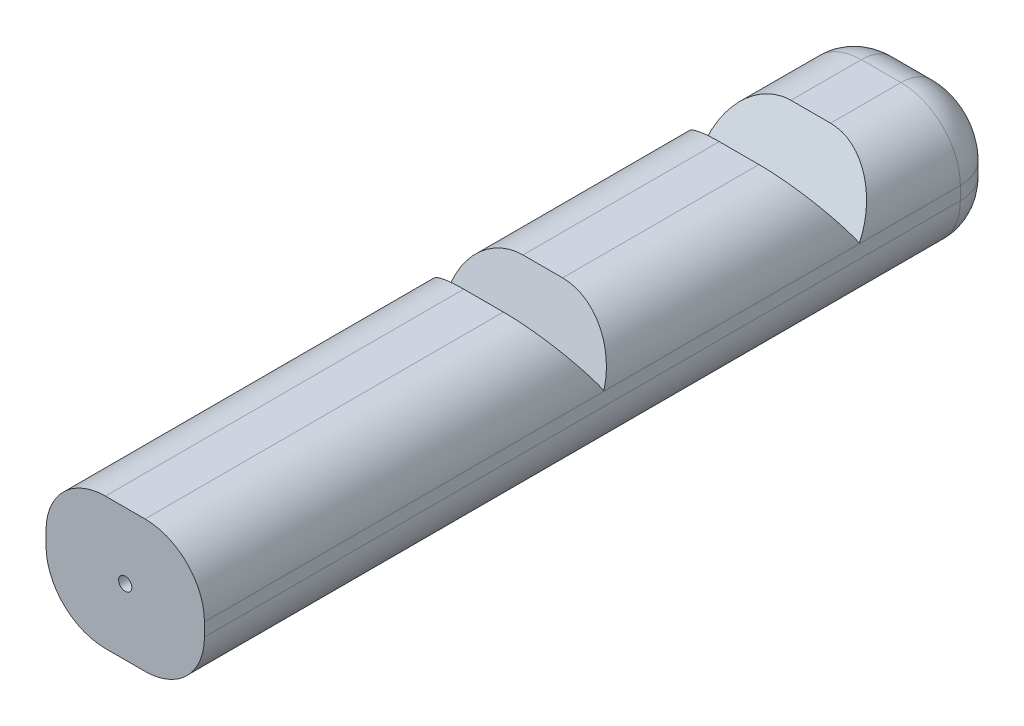
ISO-10303-21;
HEADER;
FILE_DESCRIPTION(('STEP AP214'),'2;1');
FILE_NAME('part.step','',(''),(''),'','','');
FILE_SCHEMA(('AUTOMOTIVE_DESIGN { 1 0 10303 214 1 1 1 1 }'));
ENDSEC;
DATA;
#1=APPLICATION_CONTEXT('core data for automotive mechanical design processes');
#2=APPLICATION_PROTOCOL_DEFINITION('international standard','automotive_design',2000,#1);
#3=PRODUCT_CONTEXT('',#1,'mechanical');
#4=PRODUCT('Part','Part','',(#3));
#5=PRODUCT_RELATED_PRODUCT_CATEGORY('part','',(#4));
#6=PRODUCT_DEFINITION_FORMATION('','',#4);
#7=PRODUCT_DEFINITION_CONTEXT('part definition',#1,'design');
#8=PRODUCT_DEFINITION('design','',#6,#7);
#9=PRODUCT_DEFINITION_SHAPE('','',#8);
#10=(LENGTH_UNIT() NAMED_UNIT(*) SI_UNIT(.MILLI.,.METRE.));
#11=(NAMED_UNIT(*) PLANE_ANGLE_UNIT() SI_UNIT($,.RADIAN.));
#12=(NAMED_UNIT(*) SI_UNIT($,.STERADIAN.) SOLID_ANGLE_UNIT());
#13=UNCERTAINTY_MEASURE_WITH_UNIT(LENGTH_MEASURE(1.E-05),#10,'distance_accuracy_value','');
#14=(GEOMETRIC_REPRESENTATION_CONTEXT(3) GLOBAL_UNCERTAINTY_ASSIGNED_CONTEXT((#13)) GLOBAL_UNIT_ASSIGNED_CONTEXT((#10,
#11,#12)) REPRESENTATION_CONTEXT('',''));
#15=CARTESIAN_POINT('',(0.,0.,0.));
#16=DIRECTION('',(0.,0.,1.));
#17=DIRECTION('',(1.,0.,0.));
#18=AXIS2_PLACEMENT_3D('',#15,#16,#17);
#19=CARTESIAN_POINT('',(12.,0.,-35.9238450728293));
#20=DIRECTION('',(0.,0.,1.));
#21=DIRECTION('',(1.,0.,0.));
#22=AXIS2_PLACEMENT_3D('',#19,#20,#21);
#23=PLANE('',#22);
#24=CARTESIAN_POINT('',(6.,5.,-35.9238450728293));
#25=DIRECTION('',(0.,0.,1.));
#26=DIRECTION('',(1.,0.,0.));
#27=AXIS2_PLACEMENT_3D('',#24,#25,#26);
#28=CIRCLE('',#27,0.500000000000002);
#29=CARTESIAN_POINT('',(6.5,5.,-35.9238450728293));
#30=VERTEX_POINT('',#29);
#31=EDGE_CURVE('E325',#30,#30,#28,.T.);
#32=ORIENTED_EDGE('',*,*,#31,.T.);
#33=EDGE_LOOP('',(#32));
#34=FACE_BOUND('',#33,.T.);
#35=CARTESIAN_POINT('',(4.5,5.5,-35.9238450728293));
#36=DIRECTION('',(0.,0.,1.));
#37=DIRECTION('',(1.,0.,0.));
#38=AXIS2_PLACEMENT_3D('',#35,#36,#37);
#39=CIRCLE('',#38,1.25);
#40=CARTESIAN_POINT('',(4.5,6.75,-35.9238450728293));
#41=VERTEX_POINT('',#40);
#42=CARTESIAN_POINT('',(3.25,5.5,-35.9238450728293));
#43=VERTEX_POINT('',#42);
#44=EDGE_CURVE('E212',#41,#43,#39,.T.);
#45=ORIENTED_EDGE('',*,*,#44,.F.);
#46=DIRECTION('',(-1.,0.,0.));
#47=VECTOR('',#46,1.);
#48=CARTESIAN_POINT('',(12.,6.75,-35.9238450728293));
#49=LINE('',#48,#47);
#50=CARTESIAN_POINT('',(7.5,6.75,-35.9238450728293));
#51=VERTEX_POINT('',#50);
#52=EDGE_CURVE('E190',#41,#51,#49,.F.);
#53=ORIENTED_EDGE('',*,*,#52,.T.);
#54=CARTESIAN_POINT('',(7.5,5.5,-35.9238450728293));
#55=DIRECTION('',(0.,0.,1.));
#56=DIRECTION('',(1.,0.,0.));
#57=AXIS2_PLACEMENT_3D('',#54,#55,#56);
#58=CIRCLE('',#57,1.25);
#59=CARTESIAN_POINT('',(8.75,5.5,-35.9238450728293));
#60=VERTEX_POINT('',#59);
#61=EDGE_CURVE('E184',#60,#51,#58,.T.);
#62=ORIENTED_EDGE('',*,*,#61,.F.);
#63=DIRECTION('',(0.,1.,0.));
#64=VECTOR('',#63,1.);
#65=CARTESIAN_POINT('',(8.75,0.,-35.9238450728293));
#66=LINE('',#65,#64);
#67=CARTESIAN_POINT('',(8.75,4.5,-35.9238450728293));
#68=VERTEX_POINT('',#67);
#69=EDGE_CURVE('E192',#60,#68,#66,.F.);
#70=ORIENTED_EDGE('',*,*,#69,.T.);
#71=CARTESIAN_POINT('',(7.5,4.5,-35.9238450728293));
#72=DIRECTION('',(0.,0.,1.));
#73=DIRECTION('',(1.,0.,0.));
#74=AXIS2_PLACEMENT_3D('',#71,#72,#73);
#75=CIRCLE('',#74,1.25);
#76=CARTESIAN_POINT('',(7.5,3.25,-35.9238450728293));
#77=VERTEX_POINT('',#76);
#78=EDGE_CURVE('E185',#77,#68,#75,.T.);
#79=ORIENTED_EDGE('',*,*,#78,.F.);
#80=DIRECTION('',(-1.,0.,0.));
#81=VECTOR('',#80,1.);
#82=CARTESIAN_POINT('',(12.,3.25,-35.9238450728293));
#83=LINE('',#82,#81);
#84=CARTESIAN_POINT('',(4.5,3.25,-35.9238450728293));
#85=VERTEX_POINT('',#84);
#86=EDGE_CURVE('E183',#77,#85,#83,.T.);
#87=ORIENTED_EDGE('',*,*,#86,.T.);
#88=CARTESIAN_POINT('',(4.5,4.5,-35.9238450728293));
#89=DIRECTION('',(0.,0.,1.));
#90=DIRECTION('',(1.,0.,0.));
#91=AXIS2_PLACEMENT_3D('',#88,#89,#90);
#92=CIRCLE('',#91,1.25);
#93=CARTESIAN_POINT('',(3.25,4.5,-35.9238450728293));
#94=VERTEX_POINT('',#93);
#95=EDGE_CURVE('E167',#94,#85,#92,.T.);
#96=ORIENTED_EDGE('',*,*,#95,.F.);
#97=DIRECTION('',(0.,1.,0.));
#98=VECTOR('',#97,1.);
#99=CARTESIAN_POINT('',(3.25,0.,-35.9238450728293));
#100=LINE('',#99,#98);
#101=EDGE_CURVE('E180',#94,#43,#100,.T.);
#102=ORIENTED_EDGE('',*,*,#101,.T.);
#103=EDGE_LOOP('',(#45,#53,#62,#70,#79,#87,#96,#102));
#104=FACE_BOUND('',#103,.T.);
#105=ADVANCED_FACE('F35',(#34,#104),#23,.F.);
#106=CARTESIAN_POINT('',(12.,10.,24.5773922889059));
#107=DIRECTION('',(0.,0.,-1.));
#108=DIRECTION('',(-1.,0.,0.));
#109=AXIS2_PLACEMENT_3D('',#106,#107,#108);
#110=PLANE('',#109);
#111=CARTESIAN_POINT('',(6.,5.,24.5773922889059));
#112=DIRECTION('',(0.,0.,1.));
#113=DIRECTION('',(1.,0.,0.));
#114=AXIS2_PLACEMENT_3D('',#111,#112,#113);
#115=CIRCLE('',#114,0.500000000000002);
#116=CARTESIAN_POINT('',(6.5,5.,24.5773922889059));
#117=VERTEX_POINT('',#116);
#118=EDGE_CURVE('E275',#117,#117,#115,.T.);
#119=ORIENTED_EDGE('',*,*,#118,.F.);
#120=EDGE_LOOP('',(#119));
#121=FACE_BOUND('',#120,.T.);
#122=DIRECTION('',(-1.,0.,0.));
#123=VECTOR('',#122,1.);
#124=CARTESIAN_POINT('',(12.,0.,24.5773922889059));
#125=LINE('',#124,#123);
#126=CARTESIAN_POINT('',(7.5,0.,24.5773922889059));
#127=VERTEX_POINT('',#126);
#128=CARTESIAN_POINT('',(4.5,0.,24.5773922889059));
#129=VERTEX_POINT('',#128);
#130=EDGE_CURVE('E291',#127,#129,#125,.T.);
#131=ORIENTED_EDGE('',*,*,#130,.F.);
#132=CARTESIAN_POINT('',(7.5,4.5,24.5773922889059));
#133=DIRECTION('',(0.,0.,-1.));
#134=DIRECTION('',(-1.,0.,0.));
#135=AXIS2_PLACEMENT_3D('',#132,#133,#134);
#136=CIRCLE('',#135,4.5);
#137=CARTESIAN_POINT('',(12.,4.5,24.5773922889059));
#138=VERTEX_POINT('',#137);
#139=EDGE_CURVE('E243',#127,#138,#136,.F.);
#140=ORIENTED_EDGE('',*,*,#139,.T.);
#141=DIRECTION('',(0.,-1.,0.));
#142=VECTOR('',#141,1.);
#143=CARTESIAN_POINT('',(12.,10.,24.5773922889059));
#144=LINE('',#143,#142);
#145=CARTESIAN_POINT('',(12.,5.5,24.5773922889059));
#146=VERTEX_POINT('',#145);
#147=EDGE_CURVE('E322',#146,#138,#144,.T.);
#148=ORIENTED_EDGE('',*,*,#147,.F.);
#149=CARTESIAN_POINT('',(7.5,5.5,24.5773922889059));
#150=DIRECTION('',(0.,0.,-1.));
#151=DIRECTION('',(-1.,0.,0.));
#152=AXIS2_PLACEMENT_3D('',#149,#150,#151);
#153=CIRCLE('',#152,4.5);
#154=CARTESIAN_POINT('',(7.5,10.,24.5773922889059));
#155=VERTEX_POINT('',#154);
#156=EDGE_CURVE('E239',#146,#155,#153,.F.);
#157=ORIENTED_EDGE('',*,*,#156,.T.);
#158=DIRECTION('',(-1.,0.,0.));
#159=VECTOR('',#158,1.);
#160=CARTESIAN_POINT('',(12.,10.,24.5773922889059));
#161=LINE('',#160,#159);
#162=CARTESIAN_POINT('',(4.5,10.,24.5773922889059));
#163=VERTEX_POINT('',#162);
#164=EDGE_CURVE('E319',#155,#163,#161,.T.);
#165=ORIENTED_EDGE('',*,*,#164,.T.);
#166=CARTESIAN_POINT('',(4.5,5.5,24.5773922889059));
#167=DIRECTION('',(0.,0.,-1.));
#168=DIRECTION('',(-1.,0.,0.));
#169=AXIS2_PLACEMENT_3D('',#166,#167,#168);
#170=CIRCLE('',#169,4.5);
#171=CARTESIAN_POINT('',(0.,5.5,24.5773922889059));
#172=VERTEX_POINT('',#171);
#173=EDGE_CURVE('E236',#163,#172,#170,.F.);
#174=ORIENTED_EDGE('',*,*,#173,.T.);
#175=DIRECTION('',(0.,-1.,0.));
#176=VECTOR('',#175,1.);
#177=CARTESIAN_POINT('',(0.,10.,24.5773922889059));
#178=LINE('',#177,#176);
#179=CARTESIAN_POINT('',(0.,4.5,24.5773922889059));
#180=VERTEX_POINT('',#179);
#181=EDGE_CURVE('E323',#172,#180,#178,.T.);
#182=ORIENTED_EDGE('',*,*,#181,.T.);
#183=CARTESIAN_POINT('',(4.5,4.5,24.5773922889059));
#184=DIRECTION('',(0.,0.,-1.));
#185=DIRECTION('',(-1.,0.,0.));
#186=AXIS2_PLACEMENT_3D('',#183,#184,#185);
#187=CIRCLE('',#186,4.5);
#188=EDGE_CURVE('E241',#180,#129,#187,.F.);
#189=ORIENTED_EDGE('',*,*,#188,.T.);
#190=EDGE_LOOP('',(#131,#140,#148,#157,#165,#174,#182,#189));
#191=FACE_BOUND('',#190,.T.);
#192=ADVANCED_FACE('F295',(#121,#191),#110,.F.);
#193=CARTESIAN_POINT('',(12.,0.,24.5773922889059));
#194=DIRECTION('',(0.,1.,0.));
#195=DIRECTION('',(0.,0.,1.));
#196=AXIS2_PLACEMENT_3D('',#193,#194,#195);
#197=PLANE('',#196);
#198=DIRECTION('',(-1.,0.,0.));
#199=VECTOR('',#198,1.);
#200=CARTESIAN_POINT('',(12.,0.,-32.6738450728293));
#201=LINE('',#200,#199);
#202=CARTESIAN_POINT('',(4.5,0.,-32.6738450728293));
#203=VERTEX_POINT('',#202);
#204=CARTESIAN_POINT('',(7.5,0.,-32.6738450728293));
#205=VERTEX_POINT('',#204);
#206=EDGE_CURVE('E201',#203,#205,#201,.F.);
#207=ORIENTED_EDGE('',*,*,#206,.T.);
#208=DIRECTION('',(0.,0.,-1.));
#209=VECTOR('',#208,1.);
#210=CARTESIAN_POINT('',(7.5,0.,24.5773922889059));
#211=LINE('',#210,#209);
#212=EDGE_CURVE('E234',#205,#127,#211,.F.);
#213=ORIENTED_EDGE('',*,*,#212,.T.);
#214=ORIENTED_EDGE('',*,*,#130,.T.);
#215=DIRECTION('',(0.,0.,-1.));
#216=VECTOR('',#215,1.);
#217=CARTESIAN_POINT('',(4.5,0.,24.5773922889059));
#218=LINE('',#217,#216);
#219=EDGE_CURVE('E232',#129,#203,#218,.T.);
#220=ORIENTED_EDGE('',*,*,#219,.T.);
#221=EDGE_LOOP('',(#207,#213,#214,#220));
#222=FACE_BOUND('',#221,.T.);
#223=ADVANCED_FACE('F290',(#222),#197,.F.);
#224=CARTESIAN_POINT('',(12.,10.,-35.9238450728293));
#225=DIRECTION('',(0.,-1.,0.));
#226=DIRECTION('',(0.,0.,-1.));
#227=AXIS2_PLACEMENT_3D('',#224,#225,#226);
#228=PLANE('',#227);
#229=DIRECTION('',(-1.,0.,0.));
#230=VECTOR('',#229,1.);
#231=CARTESIAN_POINT('',(12.,10.,-27.3434418445087));
#232=LINE('',#231,#230);
#233=CARTESIAN_POINT('',(7.5,10.,-27.3434418445087));
#234=VERTEX_POINT('',#233);
#235=CARTESIAN_POINT('',(4.5,10.,-27.3434418445087));
#236=VERTEX_POINT('',#235);
#237=EDGE_CURVE('E300',#234,#236,#232,.T.);
#238=ORIENTED_EDGE('',*,*,#237,.F.);
#239=DIRECTION('',(0.,0.,1.));
#240=VECTOR('',#239,1.);
#241=CARTESIAN_POINT('',(7.5,10.,-32.6738450728293));
#242=LINE('',#241,#240);
#243=CARTESIAN_POINT('',(7.5,10.,-32.6738450728293));
#244=VERTEX_POINT('',#243);
#245=EDGE_CURVE('E259',#234,#244,#242,.F.);
#246=ORIENTED_EDGE('',*,*,#245,.T.);
#247=DIRECTION('',(-1.,0.,0.));
#248=VECTOR('',#247,1.);
#249=CARTESIAN_POINT('',(12.,10.,-32.6738450728293));
#250=LINE('',#249,#248);
#251=CARTESIAN_POINT('',(4.5,10.,-32.6738450728293));
#252=VERTEX_POINT('',#251);
#253=EDGE_CURVE('E175',#244,#252,#250,.T.);
#254=ORIENTED_EDGE('',*,*,#253,.T.);
#255=DIRECTION('',(0.,0.,1.));
#256=VECTOR('',#255,1.);
#257=CARTESIAN_POINT('',(4.5,10.,-35.9238450728293));
#258=LINE('',#257,#256);
#259=EDGE_CURVE('E257',#252,#236,#258,.T.);
#260=ORIENTED_EDGE('',*,*,#259,.T.);
#261=EDGE_LOOP('',(#238,#246,#254,#260));
#262=FACE_BOUND('',#261,.T.);
#263=ADVANCED_FACE('F346',(#262),#228,.F.);
#264=CARTESIAN_POINT('',(12.,10.,-27.3434418445087));
#265=DIRECTION('',(0.,-0.462139094755807,-0.886807452098979));
#266=DIRECTION('',(0.,0.886807452098979,-0.462139094755807));
#267=AXIS2_PLACEMENT_3D('',#264,#265,#266);
#268=PLANE('',#267);
#269=DIRECTION('',(-1.,0.,0.));
#270=VECTOR('',#269,1.);
#271=CARTESIAN_POINT('',(12.,5.55322168459297,-25.0261066660572));
#272=LINE('',#271,#270);
#273=CARTESIAN_POINT('',(11.9996852614699,5.55322168459297,-25.0261066660572));
#274=VERTEX_POINT('',#273);
#275=CARTESIAN_POINT('',(0.000314738530142813,5.55322168459297,-25.0261066660572));
#276=VERTEX_POINT('',#275);
#277=EDGE_CURVE('E304',#274,#276,#272,.T.);
#278=ORIENTED_EDGE('',*,*,#277,.F.);
#279=CARTESIAN_POINT('',(7.5,5.5,-24.9983714219735));
#280=DIRECTION('',(0.,-0.462139094755807,-0.886807452098979));
#281=DIRECTION('',(0.,0.886807452098979,-0.462139094755807));
#282=AXIS2_PLACEMENT_3D('',#279,#280,#281);
#283=ELLIPSE('',#282,5.07438225665445,4.5);
#284=EDGE_CURVE('E255',#274,#234,#283,.F.);
#285=ORIENTED_EDGE('',*,*,#284,.T.);
#286=ORIENTED_EDGE('',*,*,#237,.T.);
#287=CARTESIAN_POINT('',(4.5,5.5,-24.9983714219735));
#288=DIRECTION('',(0.,-0.462139094755807,-0.886807452098979));
#289=DIRECTION('',(0.,-0.886807452098979,0.462139094755807));
#290=AXIS2_PLACEMENT_3D('',#287,#288,#289);
#291=ELLIPSE('',#290,5.07438225665445,4.5);
#292=EDGE_CURVE('E253',#236,#276,#291,.F.);
#293=ORIENTED_EDGE('',*,*,#292,.T.);
#294=EDGE_LOOP('',(#278,#285,#286,#293));
#295=FACE_BOUND('',#294,.T.);
#296=ADVANCED_FACE('F488',(#295),#268,.F.);
#297=CARTESIAN_POINT('',(12.,5.55322168459297,-25.0261066660572));
#298=DIRECTION('',(0.,-0.572854914196566,0.819656786271452));
#299=DIRECTION('',(0.,-0.819656786271453,-0.572854914196566));
#300=AXIS2_PLACEMENT_3D('',#297,#298,#299);
#301=PLANE('',#300);
#302=CARTESIAN_POINT('',(7.5,5.5,-25.0633030927464));
#303=DIRECTION('',(0.,-0.572854914196566,0.819656786271452));
#304=DIRECTION('',(0.,-0.819656786271453,-0.572854914196566));
#305=AXIS2_PLACEMENT_3D('',#302,#303,#304);
#306=ELLIPSE('',#305,5.49010277883516,4.5);
#307=CARTESIAN_POINT('',(7.5,10.,-21.9182707364465));
#308=VERTEX_POINT('',#307);
#309=EDGE_CURVE('E251',#308,#274,#306,.F.);
#310=ORIENTED_EDGE('',*,*,#309,.T.);
#311=ORIENTED_EDGE('',*,*,#277,.T.);
#312=CARTESIAN_POINT('',(4.5,5.5,-25.0633030927464));
#313=DIRECTION('',(0.,-0.572854914196566,0.819656786271452));
#314=DIRECTION('',(0.,0.819656786271453,0.572854914196566));
#315=AXIS2_PLACEMENT_3D('',#312,#313,#314);
#316=ELLIPSE('',#315,5.49010277883516,4.5);
#317=CARTESIAN_POINT('',(4.5,10.,-21.9182707364465));
#318=VERTEX_POINT('',#317);
#319=EDGE_CURVE('E249',#276,#318,#316,.F.);
#320=ORIENTED_EDGE('',*,*,#319,.T.);
#321=DIRECTION('',(-1.,0.,0.));
#322=VECTOR('',#321,1.);
#323=CARTESIAN_POINT('',(12.,10.,-21.9182707364465));
#324=LINE('',#323,#322);
#325=EDGE_CURVE('E309',#308,#318,#324,.T.);
#326=ORIENTED_EDGE('',*,*,#325,.F.);
#327=EDGE_LOOP('',(#310,#311,#320,#326));
#328=FACE_BOUND('',#327,.T.);
#329=ADVANCED_FACE('F481',(#328),#301,.F.);
#330=CARTESIAN_POINT('',(12.,10.,-21.9182707364465));
#331=DIRECTION('',(0.,-1.,0.));
#332=DIRECTION('',(0.,0.,-1.));
#333=AXIS2_PLACEMENT_3D('',#330,#331,#332);
#334=PLANE('',#333);
#335=DIRECTION('',(-1.,0.,0.));
#336=VECTOR('',#335,1.);
#337=CARTESIAN_POINT('',(12.,10.,-7.05110136293291));
#338=LINE('',#337,#336);
#339=CARTESIAN_POINT('',(7.5,10.,-7.05110136293291));
#340=VERTEX_POINT('',#339);
#341=CARTESIAN_POINT('',(4.5,10.,-7.05110136293291));
#342=VERTEX_POINT('',#341);
#343=EDGE_CURVE('E311',#340,#342,#338,.T.);
#344=ORIENTED_EDGE('',*,*,#343,.F.);
#345=DIRECTION('',(0.,0.,1.));
#346=VECTOR('',#345,1.);
#347=CARTESIAN_POINT('',(7.5,10.,-21.9182707364465));
#348=LINE('',#347,#346);
#349=EDGE_CURVE('E269',#340,#308,#348,.F.);
#350=ORIENTED_EDGE('',*,*,#349,.T.);
#351=ORIENTED_EDGE('',*,*,#325,.T.);
#352=DIRECTION('',(0.,0.,1.));
#353=VECTOR('',#352,1.);
#354=CARTESIAN_POINT('',(4.5,10.,-21.9182707364465));
#355=LINE('',#354,#353);
#356=EDGE_CURVE('E52',#318,#342,#355,.T.);
#357=ORIENTED_EDGE('',*,*,#356,.T.);
#358=EDGE_LOOP('',(#344,#350,#351,#357));
#359=FACE_BOUND('',#358,.T.);
#360=ADVANCED_FACE('F474',(#359),#334,.F.);
#361=CARTESIAN_POINT('',(12.,10.,-7.05110136293291));
#362=DIRECTION('',(0.,-0.295976029358374,-0.955195367474765));
#363=DIRECTION('',(0.,0.955195367474765,-0.295976029358374));
#364=AXIS2_PLACEMENT_3D('',#361,#362,#363);
#365=PLANE('',#364);
#366=DIRECTION('',(-1.,0.,0.));
#367=VECTOR('',#366,1.);
#368=CARTESIAN_POINT('',(12.,5.55322168459296,-5.67322639196173));
#369=LINE('',#368,#367);
#370=CARTESIAN_POINT('',(11.9996852614699,5.55322168459296,-5.67322639196173));
#371=VERTEX_POINT('',#370);
#372=CARTESIAN_POINT('',(0.000314738530139344,5.55322168459296,-5.67322639196173));
#373=VERTEX_POINT('',#372);
#374=EDGE_CURVE('E313',#371,#373,#369,.T.);
#375=ORIENTED_EDGE('',*,*,#374,.F.);
#376=CARTESIAN_POINT('',(7.5,5.5,-5.65673516574983));
#377=DIRECTION('',(0.,-0.295976029358374,-0.955195367474765));
#378=DIRECTION('',(0.,0.955195367474765,-0.295976029358374));
#379=AXIS2_PLACEMENT_3D('',#376,#377,#378);
#380=ELLIPSE('',#379,4.71107812415022,4.5);
#381=EDGE_CURVE('E59',#371,#340,#380,.F.);
#382=ORIENTED_EDGE('',*,*,#381,.T.);
#383=ORIENTED_EDGE('',*,*,#343,.T.);
#384=CARTESIAN_POINT('',(4.5,5.5,-5.65673516574983));
#385=DIRECTION('',(0.,-0.295976029358374,-0.955195367474765));
#386=DIRECTION('',(0.,-0.955195367474765,0.295976029358374));
#387=AXIS2_PLACEMENT_3D('',#384,#385,#386);
#388=ELLIPSE('',#387,4.71107812415022,4.5);
#389=EDGE_CURVE('E265',#342,#373,#388,.F.);
#390=ORIENTED_EDGE('',*,*,#389,.T.);
#391=EDGE_LOOP('',(#375,#382,#383,#390));
#392=FACE_BOUND('',#391,.T.);
#393=ADVANCED_FACE('F466',(#392),#365,.F.);
#394=CARTESIAN_POINT('',(12.,5.55322168459296,-5.67322639196173));
#395=DIRECTION('',(0.,-0.572854914196566,0.819656786271452));
#396=DIRECTION('',(0.,-0.819656786271452,-0.572854914196566));
#397=AXIS2_PLACEMENT_3D('',#394,#395,#396);
#398=PLANE('',#397);
#399=CARTESIAN_POINT('',(7.5,5.50000000000001,-5.71042281865099));
#400=DIRECTION('',(0.,-0.572854914196566,0.819656786271452));
#401=DIRECTION('',(0.,-0.819656786271452,-0.572854914196566));
#402=AXIS2_PLACEMENT_3D('',#399,#400,#401);
#403=ELLIPSE('',#402,5.49010277883516,4.5);
#404=CARTESIAN_POINT('',(7.5,10.,-2.56539046235104));
#405=VERTEX_POINT('',#404);
#406=EDGE_CURVE('E263',#405,#371,#403,.F.);
#407=ORIENTED_EDGE('',*,*,#406,.T.);
#408=ORIENTED_EDGE('',*,*,#374,.T.);
#409=CARTESIAN_POINT('',(4.5,5.5,-5.71042281865099));
#410=DIRECTION('',(0.,-0.572854914196566,0.819656786271452));
#411=DIRECTION('',(0.,0.819656786271452,0.572854914196566));
#412=AXIS2_PLACEMENT_3D('',#409,#410,#411);
#413=ELLIPSE('',#412,5.49010277883516,4.5);
#414=CARTESIAN_POINT('',(4.5,10.,-2.56539046235104));
#415=VERTEX_POINT('',#414);
#416=EDGE_CURVE('E261',#373,#415,#413,.F.);
#417=ORIENTED_EDGE('',*,*,#416,.T.);
#418=DIRECTION('',(-1.,0.,0.));
#419=VECTOR('',#418,1.);
#420=CARTESIAN_POINT('',(12.,10.,-2.56539046235104));
#421=LINE('',#420,#419);
#422=EDGE_CURVE('E316',#405,#415,#421,.T.);
#423=ORIENTED_EDGE('',*,*,#422,.F.);
#424=EDGE_LOOP('',(#407,#408,#417,#423));
#425=FACE_BOUND('',#424,.T.);
#426=ADVANCED_FACE('F458',(#425),#398,.F.);
#427=CARTESIAN_POINT('',(12.,10.,-2.56539046235104));
#428=DIRECTION('',(0.,-1.,0.));
#429=DIRECTION('',(0.,0.,-1.));
#430=AXIS2_PLACEMENT_3D('',#427,#428,#429);
#431=PLANE('',#430);
#432=ORIENTED_EDGE('',*,*,#164,.F.);
#433=DIRECTION('',(0.,0.,1.));
#434=VECTOR('',#433,1.);
#435=CARTESIAN_POINT('',(7.5,10.,-2.56539046235104));
#436=LINE('',#435,#434);
#437=EDGE_CURVE('E11',#155,#405,#436,.F.);
#438=ORIENTED_EDGE('',*,*,#437,.T.);
#439=ORIENTED_EDGE('',*,*,#422,.T.);
#440=DIRECTION('',(0.,0.,1.));
#441=VECTOR('',#440,1.);
#442=CARTESIAN_POINT('',(4.5,10.,-2.56539046235104));
#443=LINE('',#442,#441);
#444=EDGE_CURVE('E44',#415,#163,#443,.T.);
#445=ORIENTED_EDGE('',*,*,#444,.T.);
#446=EDGE_LOOP('',(#432,#438,#439,#445));
#447=FACE_BOUND('',#446,.T.);
#448=ADVANCED_FACE('F450',(#447),#431,.F.);
#449=CARTESIAN_POINT('',(12.,0.,0.));
#450=DIRECTION('',(1.,0.,0.));
#451=DIRECTION('',(0.,0.,-1.));
#452=AXIS2_PLACEMENT_3D('',#449,#450,#451);
#453=PLANE('',#452);
#454=ORIENTED_EDGE('',*,*,#147,.T.);
#455=DIRECTION('',(0.,0.,-1.));
#456=VECTOR('',#455,1.);
#457=CARTESIAN_POINT('',(12.,4.5,-32.6738450728293));
#458=LINE('',#457,#456);
#459=CARTESIAN_POINT('',(12.,4.5,-32.6738450728293));
#460=VERTEX_POINT('',#459);
#461=EDGE_CURVE('E230',#138,#460,#458,.T.);
#462=ORIENTED_EDGE('',*,*,#461,.T.);
#463=DIRECTION('',(0.,1.,0.));
#464=VECTOR('',#463,1.);
#465=CARTESIAN_POINT('',(12.,10.,-32.6738450728293));
#466=LINE('',#465,#464);
#467=CARTESIAN_POINT('',(12.,5.5,-32.6738450728293));
#468=VERTEX_POINT('',#467);
#469=EDGE_CURVE('E195',#460,#468,#466,.T.);
#470=ORIENTED_EDGE('',*,*,#469,.T.);
#471=DIRECTION('',(0.,0.,1.));
#472=VECTOR('',#471,1.);
#473=CARTESIAN_POINT('',(12.,5.5,24.5773922889059));
#474=LINE('',#473,#472);
#475=EDGE_CURVE('E228',#468,#146,#474,.T.);
#476=ORIENTED_EDGE('',*,*,#475,.T.);
#477=EDGE_LOOP('',(#454,#462,#470,#476));
#478=FACE_BOUND('',#477,.T.);
#479=ADVANCED_FACE('F442',(#478),#453,.T.);
#480=CARTESIAN_POINT('',(0.,0.,0.));
#481=DIRECTION('',(1.,0.,0.));
#482=DIRECTION('',(0.,0.,-1.));
#483=AXIS2_PLACEMENT_3D('',#480,#481,#482);
#484=PLANE('',#483);
#485=DIRECTION('',(0.,1.,0.));
#486=VECTOR('',#485,1.);
#487=CARTESIAN_POINT('',(0.,0.,-32.6738450728293));
#488=LINE('',#487,#486);
#489=CARTESIAN_POINT('',(0.,5.5,-32.6738450728293));
#490=VERTEX_POINT('',#489);
#491=CARTESIAN_POINT('',(0.,4.5,-32.6738450728293));
#492=VERTEX_POINT('',#491);
#493=EDGE_CURVE('E204',#490,#492,#488,.F.);
#494=ORIENTED_EDGE('',*,*,#493,.T.);
#495=DIRECTION('',(0.,0.,-1.));
#496=VECTOR('',#495,1.);
#497=CARTESIAN_POINT('',(0.,4.5,0.));
#498=LINE('',#497,#496);
#499=EDGE_CURVE('E247',#492,#180,#498,.F.);
#500=ORIENTED_EDGE('',*,*,#499,.T.);
#501=ORIENTED_EDGE('',*,*,#181,.F.);
#502=DIRECTION('',(0.,0.,1.));
#503=VECTOR('',#502,1.);
#504=CARTESIAN_POINT('',(0.,5.49999999999999,0.));
#505=LINE('',#504,#503);
#506=EDGE_CURVE('E245',#172,#490,#505,.F.);
#507=ORIENTED_EDGE('',*,*,#506,.T.);
#508=EDGE_LOOP('',(#494,#500,#501,#507));
#509=FACE_BOUND('',#508,.T.);
#510=ADVANCED_FACE('F336',(#509),#484,.F.);
#511=CARTESIAN_POINT('',(6.,5.,-35.9238450728293));
#512=DIRECTION('',(0.,0.,1.));
#513=DIRECTION('',(1.,0.,0.));
#514=AXIS2_PLACEMENT_3D('',#511,#512,#513);
#515=CYLINDRICAL_SURFACE('',#514,0.500000000000002);
#516=ORIENTED_EDGE('',*,*,#31,.F.);
#517=EDGE_LOOP('',(#516));
#518=FACE_BOUND('',#517,.T.);
#519=ORIENTED_EDGE('',*,*,#118,.T.);
#520=EDGE_LOOP('',(#519));
#521=FACE_BOUND('',#520,.T.);
#522=ADVANCED_FACE('F333',(#518,#521),#515,.F.);
#523=CARTESIAN_POINT('',(3.25,0.,-32.6738450728293));
#524=DIRECTION('',(0.,1.,0.));
#525=DIRECTION('',(0.,0.,1.));
#526=AXIS2_PLACEMENT_3D('',#523,#524,#525);
#527=CYLINDRICAL_SURFACE('',#526,3.25);
#528=ORIENTED_EDGE('',*,*,#493,.F.);
#529=CARTESIAN_POINT('',(3.25,5.5,-32.6738450728293));
#530=DIRECTION('',(0.,-1.,0.));
#531=DIRECTION('',(0.,0.,-1.));
#532=AXIS2_PLACEMENT_3D('',#529,#530,#531);
#533=CIRCLE('',#532,3.25);
#534=EDGE_CURVE('E174',#490,#43,#533,.T.);
#535=ORIENTED_EDGE('',*,*,#534,.T.);
#536=ORIENTED_EDGE('',*,*,#101,.F.);
#537=CARTESIAN_POINT('',(3.25,4.5,-32.6738450728293));
#538=DIRECTION('',(0.,1.,0.));
#539=DIRECTION('',(0.,0.,1.));
#540=AXIS2_PLACEMENT_3D('',#537,#538,#539);
#541=CIRCLE('',#540,3.25);
#542=EDGE_CURVE('E163',#94,#492,#541,.T.);
#543=ORIENTED_EDGE('',*,*,#542,.T.);
#544=EDGE_LOOP('',(#528,#535,#536,#543));
#545=FACE_BOUND('',#544,.T.);
#546=ADVANCED_FACE('F188',(#545),#527,.T.);
#547=CARTESIAN_POINT('',(12.,3.25,-32.6738450728293));
#548=DIRECTION('',(-1.,0.,0.));
#549=DIRECTION('',(0.,0.,1.));
#550=AXIS2_PLACEMENT_3D('',#547,#548,#549);
#551=CYLINDRICAL_SURFACE('',#550,3.25);
#552=ORIENTED_EDGE('',*,*,#206,.F.);
#553=CARTESIAN_POINT('',(4.5,3.25,-32.6738450728293));
#554=DIRECTION('',(1.,0.,0.));
#555=DIRECTION('',(0.,0.,-1.));
#556=AXIS2_PLACEMENT_3D('',#553,#554,#555);
#557=CIRCLE('',#556,3.25);
#558=EDGE_CURVE('E221',#203,#85,#557,.T.);
#559=ORIENTED_EDGE('',*,*,#558,.T.);
#560=ORIENTED_EDGE('',*,*,#86,.F.);
#561=CARTESIAN_POINT('',(7.5,3.25,-32.6738450728293));
#562=DIRECTION('',(-1.,0.,0.));
#563=DIRECTION('',(0.,0.,1.));
#564=AXIS2_PLACEMENT_3D('',#561,#562,#563);
#565=CIRCLE('',#564,3.25);
#566=EDGE_CURVE('E219',#77,#205,#565,.T.);
#567=ORIENTED_EDGE('',*,*,#566,.T.);
#568=EDGE_LOOP('',(#552,#559,#560,#567));
#569=FACE_BOUND('',#568,.T.);
#570=ADVANCED_FACE('F358',(#569),#551,.T.);
#571=CARTESIAN_POINT('',(12.,6.75,-32.6738450728293));
#572=DIRECTION('',(-1.,0.,0.));
#573=DIRECTION('',(0.,0.,1.));
#574=AXIS2_PLACEMENT_3D('',#571,#572,#573);
#575=CYLINDRICAL_SURFACE('',#574,3.25);
#576=ORIENTED_EDGE('',*,*,#253,.F.);
#577=CARTESIAN_POINT('',(7.5,6.75,-32.6738450728293));
#578=DIRECTION('',(-1.,0.,0.));
#579=DIRECTION('',(0.,0.,1.));
#580=AXIS2_PLACEMENT_3D('',#577,#578,#579);
#581=CIRCLE('',#580,3.25);
#582=EDGE_CURVE('E216',#244,#51,#581,.T.);
#583=ORIENTED_EDGE('',*,*,#582,.T.);
#584=ORIENTED_EDGE('',*,*,#52,.F.);
#585=CARTESIAN_POINT('',(4.5,6.75,-32.6738450728293));
#586=DIRECTION('',(1.,0.,0.));
#587=DIRECTION('',(0.,0.,-1.));
#588=AXIS2_PLACEMENT_3D('',#585,#586,#587);
#589=CIRCLE('',#588,3.25);
#590=EDGE_CURVE('E214',#41,#252,#589,.T.);
#591=ORIENTED_EDGE('',*,*,#590,.T.);
#592=EDGE_LOOP('',(#576,#583,#584,#591));
#593=FACE_BOUND('',#592,.T.);
#594=ADVANCED_FACE('F354',(#593),#575,.T.);
#595=CARTESIAN_POINT('',(8.75,0.,-32.6738450728293));
#596=DIRECTION('',(0.,-1.,0.));
#597=DIRECTION('',(0.,0.,-1.));
#598=AXIS2_PLACEMENT_3D('',#595,#596,#597);
#599=CYLINDRICAL_SURFACE('',#598,3.25);
#600=ORIENTED_EDGE('',*,*,#469,.F.);
#601=CARTESIAN_POINT('',(8.75,4.5,-32.6738450728293));
#602=DIRECTION('',(0.,1.,0.));
#603=DIRECTION('',(0.,0.,1.));
#604=AXIS2_PLACEMENT_3D('',#601,#602,#603);
#605=CIRCLE('',#604,3.25);
#606=EDGE_CURVE('E226',#460,#68,#605,.T.);
#607=ORIENTED_EDGE('',*,*,#606,.T.);
#608=ORIENTED_EDGE('',*,*,#69,.F.);
#609=CARTESIAN_POINT('',(8.75,5.5,-32.6738450728293));
#610=DIRECTION('',(0.,-1.,0.));
#611=DIRECTION('',(0.,0.,-1.));
#612=AXIS2_PLACEMENT_3D('',#609,#610,#611);
#613=CIRCLE('',#612,3.25);
#614=EDGE_CURVE('E223',#60,#468,#613,.T.);
#615=ORIENTED_EDGE('',*,*,#614,.T.);
#616=EDGE_LOOP('',(#600,#607,#608,#615));
#617=FACE_BOUND('',#616,.T.);
#618=ADVANCED_FACE('F350',(#617),#599,.T.);
#619=CARTESIAN_POINT('',(4.5,5.5,-2.56539046235104));
#620=DIRECTION('',(0.,0.,1.));
#621=DIRECTION('',(0.,-1.,0.));
#622=AXIS2_PLACEMENT_3D('',#619,#620,#621);
#623=CYLINDRICAL_SURFACE('',#622,4.5);
#624=ORIENTED_EDGE('',*,*,#444,.F.);
#625=ORIENTED_EDGE('',*,*,#416,.F.);
#626=ORIENTED_EDGE('',*,*,#389,.F.);
#627=ORIENTED_EDGE('',*,*,#356,.F.);
#628=ORIENTED_EDGE('',*,*,#319,.F.);
#629=ORIENTED_EDGE('',*,*,#292,.F.);
#630=ORIENTED_EDGE('',*,*,#259,.F.);
#631=CARTESIAN_POINT('',(4.5,5.5,-32.6738450728293));
#632=DIRECTION('',(0.,0.,1.));
#633=DIRECTION('',(1.,0.,0.));
#634=AXIS2_PLACEMENT_3D('',#631,#632,#633);
#635=CIRCLE('',#634,4.5);
#636=EDGE_CURVE('E272',#490,#252,#635,.F.);
#637=ORIENTED_EDGE('',*,*,#636,.F.);
#638=ORIENTED_EDGE('',*,*,#506,.F.);
#639=ORIENTED_EDGE('',*,*,#173,.F.);
#640=EDGE_LOOP('',(#624,#625,#626,#627,#628,#629,#630,#637,#638,#639));
#641=FACE_BOUND('',#640,.T.);
#642=ADVANCED_FACE('F353',(#641),#623,.T.);
#643=CARTESIAN_POINT('',(4.5,5.5,-32.6738450728293));
#644=DIRECTION('',(0.,0.,1.));
#645=DIRECTION('',(1.,0.,0.));
#646=AXIS2_PLACEMENT_3D('',#643,#644,#645);
#647=DEGENERATE_TOROIDAL_SURFACE('',#646,1.25,3.25,.T.);
#648=ORIENTED_EDGE('',*,*,#534,.F.);
#649=ORIENTED_EDGE('',*,*,#636,.T.);
#650=ORIENTED_EDGE('',*,*,#590,.F.);
#651=ORIENTED_EDGE('',*,*,#44,.T.);
#652=EDGE_LOOP('',(#648,#649,#650,#651));
#653=FACE_BOUND('',#652,.T.);
#654=ADVANCED_FACE('F365',(#653),#647,.T.);
#655=CARTESIAN_POINT('',(7.5,5.5,0.));
#656=DIRECTION('',(0.,0.,-1.));
#657=DIRECTION('',(0.,1.,0.));
#658=AXIS2_PLACEMENT_3D('',#655,#656,#657);
#659=CYLINDRICAL_SURFACE('',#658,4.5);
#660=ORIENTED_EDGE('',*,*,#156,.F.);
#661=ORIENTED_EDGE('',*,*,#475,.F.);
#662=CARTESIAN_POINT('',(7.5,5.5,-32.6738450728293));
#663=DIRECTION('',(0.,0.,1.));
#664=DIRECTION('',(1.,0.,0.));
#665=AXIS2_PLACEMENT_3D('',#662,#663,#664);
#666=CIRCLE('',#665,4.5);
#667=EDGE_CURVE('E276',#244,#468,#666,.F.);
#668=ORIENTED_EDGE('',*,*,#667,.F.);
#669=ORIENTED_EDGE('',*,*,#245,.F.);
#670=ORIENTED_EDGE('',*,*,#284,.F.);
#671=ORIENTED_EDGE('',*,*,#309,.F.);
#672=ORIENTED_EDGE('',*,*,#349,.F.);
#673=ORIENTED_EDGE('',*,*,#381,.F.);
#674=ORIENTED_EDGE('',*,*,#406,.F.);
#675=ORIENTED_EDGE('',*,*,#437,.F.);
#676=EDGE_LOOP('',(#660,#661,#668,#669,#670,#671,#672,#673,#674,#675));
#677=FACE_BOUND('',#676,.T.);
#678=ADVANCED_FACE('F368',(#677),#659,.T.);
#679=CARTESIAN_POINT('',(7.5,5.5,-32.6738450728293));
#680=DIRECTION('',(0.,0.,1.));
#681=DIRECTION('',(1.,0.,0.));
#682=AXIS2_PLACEMENT_3D('',#679,#680,#681);
#683=DEGENERATE_TOROIDAL_SURFACE('',#682,1.25,3.25,.T.);
#684=ORIENTED_EDGE('',*,*,#582,.F.);
#685=ORIENTED_EDGE('',*,*,#667,.T.);
#686=ORIENTED_EDGE('',*,*,#614,.F.);
#687=ORIENTED_EDGE('',*,*,#61,.T.);
#688=EDGE_LOOP('',(#684,#685,#686,#687));
#689=FACE_BOUND('',#688,.T.);
#690=ADVANCED_FACE('F373',(#689),#683,.T.);
#691=CARTESIAN_POINT('',(4.5,4.5,24.5773922889059));
#692=DIRECTION('',(0.,0.,-1.));
#693=DIRECTION('',(-1.,0.,0.));
#694=AXIS2_PLACEMENT_3D('',#691,#692,#693);
#695=CYLINDRICAL_SURFACE('',#694,4.5);
#696=ORIENTED_EDGE('',*,*,#188,.F.);
#697=ORIENTED_EDGE('',*,*,#499,.F.);
#698=CARTESIAN_POINT('',(4.5,4.5,-32.6738450728293));
#699=DIRECTION('',(0.,0.,1.));
#700=DIRECTION('',(1.,0.,0.));
#701=AXIS2_PLACEMENT_3D('',#698,#699,#700);
#702=CIRCLE('',#701,4.5);
#703=EDGE_CURVE('E169',#203,#492,#702,.F.);
#704=ORIENTED_EDGE('',*,*,#703,.F.);
#705=ORIENTED_EDGE('',*,*,#219,.F.);
#706=EDGE_LOOP('',(#696,#697,#704,#705));
#707=FACE_BOUND('',#706,.T.);
#708=ADVANCED_FACE('F376',(#707),#695,.T.);
#709=CARTESIAN_POINT('',(4.5,4.5,-32.6738450728293));
#710=DIRECTION('',(0.,0.,1.));
#711=DIRECTION('',(1.,0.,0.));
#712=AXIS2_PLACEMENT_3D('',#709,#710,#711);
#713=DEGENERATE_TOROIDAL_SURFACE('',#712,1.25,3.25,.T.);
#714=ORIENTED_EDGE('',*,*,#542,.F.);
#715=ORIENTED_EDGE('',*,*,#95,.T.);
#716=ORIENTED_EDGE('',*,*,#558,.F.);
#717=ORIENTED_EDGE('',*,*,#703,.T.);
#718=EDGE_LOOP('',(#714,#715,#716,#717));
#719=FACE_BOUND('',#718,.T.);
#720=ADVANCED_FACE('F165',(#719),#713,.T.);
#721=CARTESIAN_POINT('',(7.5,4.5,0.));
#722=DIRECTION('',(0.,0.,1.));
#723=DIRECTION('',(1.,0.,0.));
#724=AXIS2_PLACEMENT_3D('',#721,#722,#723);
#725=CYLINDRICAL_SURFACE('',#724,4.5);
#726=ORIENTED_EDGE('',*,*,#139,.F.);
#727=ORIENTED_EDGE('',*,*,#212,.F.);
#728=CARTESIAN_POINT('',(7.5,4.5,-32.6738450728293));
#729=DIRECTION('',(0.,0.,1.));
#730=DIRECTION('',(1.,0.,0.));
#731=AXIS2_PLACEMENT_3D('',#728,#729,#730);
#732=CIRCLE('',#731,4.5);
#733=EDGE_CURVE('E39',#460,#205,#732,.F.);
#734=ORIENTED_EDGE('',*,*,#733,.F.);
#735=ORIENTED_EDGE('',*,*,#461,.F.);
#736=EDGE_LOOP('',(#726,#727,#734,#735));
#737=FACE_BOUND('',#736,.T.);
#738=ADVANCED_FACE('F37',(#737),#725,.T.);
#739=CARTESIAN_POINT('',(7.5,4.5,-32.6738450728293));
#740=DIRECTION('',(0.,0.,1.));
#741=DIRECTION('',(1.,0.,0.));
#742=AXIS2_PLACEMENT_3D('',#739,#740,#741);
#743=DEGENERATE_TOROIDAL_SURFACE('',#742,1.25,3.25,.T.);
#744=ORIENTED_EDGE('',*,*,#566,.F.);
#745=ORIENTED_EDGE('',*,*,#78,.T.);
#746=ORIENTED_EDGE('',*,*,#606,.F.);
#747=ORIENTED_EDGE('',*,*,#733,.T.);
#748=EDGE_LOOP('',(#744,#745,#746,#747));
#749=FACE_BOUND('',#748,.T.);
#750=ADVANCED_FACE('F282',(#749),#743,.T.);
#751=CLOSED_SHELL('',(#105,#192,#223,#263,#296,#329,#360,#393,#426,#448,#479,#510,#522,#546,
#570,#594,#618,#642,#654,#678,#690,#708,#720,#738,#750));
#752=MANIFOLD_SOLID_BREP('B2',#751);
#753=ADVANCED_BREP_SHAPE_REPRESENTATION('',(#18,#752),#14);
#754=SHAPE_DEFINITION_REPRESENTATION(#9,#753);
ENDSEC;
END-ISO-10303-21;
